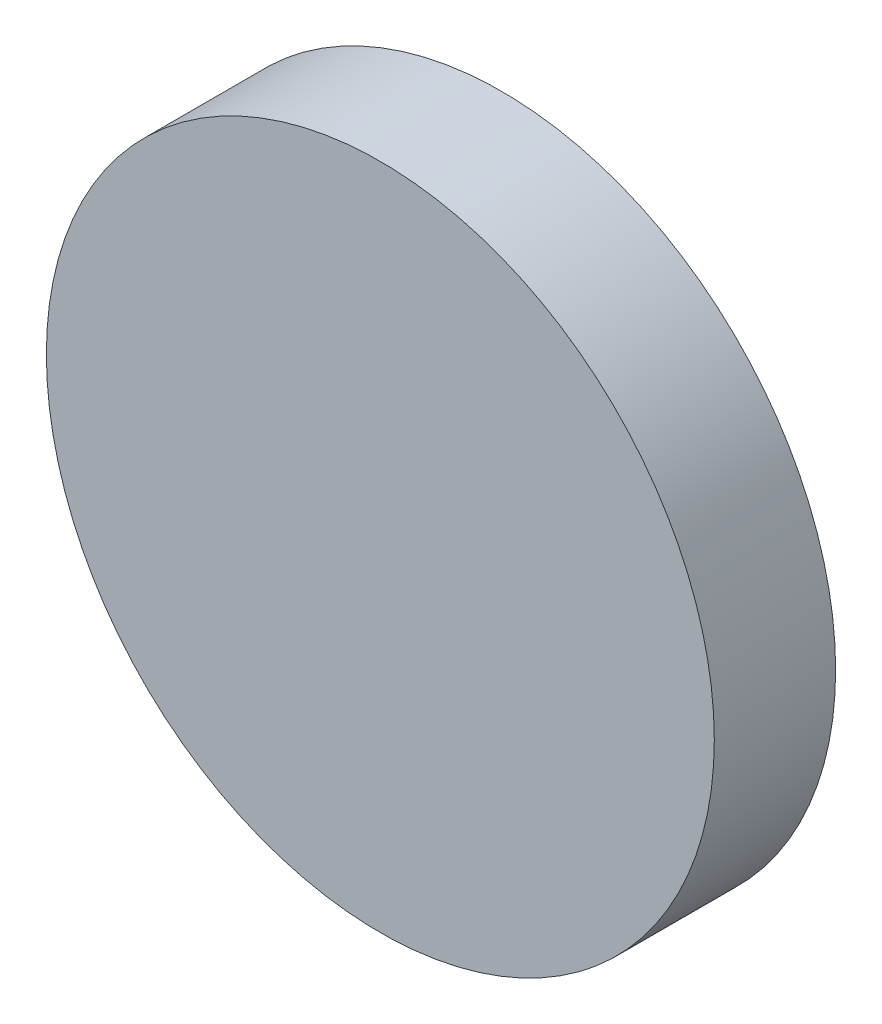
ISO-10303-21;
HEADER;
FILE_DESCRIPTION(('STEP AP214'),'2;1');
FILE_NAME('part.step','',(''),(''),'','','');
FILE_SCHEMA(('AUTOMOTIVE_DESIGN { 1 0 10303 214 1 1 1 1 }'));
ENDSEC;
DATA;
#1=APPLICATION_CONTEXT('core data for automotive mechanical design processes');
#2=APPLICATION_PROTOCOL_DEFINITION('international standard','automotive_design',2000,#1);
#3=PRODUCT_CONTEXT('',#1,'mechanical');
#4=PRODUCT('Part','Part','',(#3));
#5=PRODUCT_RELATED_PRODUCT_CATEGORY('part','',(#4));
#6=PRODUCT_DEFINITION_FORMATION('','',#4);
#7=PRODUCT_DEFINITION_CONTEXT('part definition',#1,'design');
#8=PRODUCT_DEFINITION('design','',#6,#7);
#9=PRODUCT_DEFINITION_SHAPE('','',#8);
#10=(LENGTH_UNIT() NAMED_UNIT(*) SI_UNIT(.MILLI.,.METRE.));
#11=(NAMED_UNIT(*) PLANE_ANGLE_UNIT() SI_UNIT($,.RADIAN.));
#12=(NAMED_UNIT(*) SI_UNIT($,.STERADIAN.) SOLID_ANGLE_UNIT());
#13=UNCERTAINTY_MEASURE_WITH_UNIT(LENGTH_MEASURE(1.E-05),#10,'distance_accuracy_value','');
#14=(GEOMETRIC_REPRESENTATION_CONTEXT(3) GLOBAL_UNCERTAINTY_ASSIGNED_CONTEXT((#13)) GLOBAL_UNIT_ASSIGNED_CONTEXT((#10,
#11,#12)) REPRESENTATION_CONTEXT('',''));
#15=CARTESIAN_POINT('',(0.,0.,0.));
#16=DIRECTION('',(0.,0.,1.));
#17=DIRECTION('',(1.,0.,0.));
#18=AXIS2_PLACEMENT_3D('',#15,#16,#17);
#19=CARTESIAN_POINT('',(0.,0.,10.));
#20=DIRECTION('',(0.,0.,-1.));
#21=DIRECTION('',(-1.,0.,0.));
#22=AXIS2_PLACEMENT_3D('',#19,#20,#21);
#23=CYLINDRICAL_SURFACE('',#22,27.5269863351518);
#24=CARTESIAN_POINT('',(0.,0.,10.));
#25=DIRECTION('',(0.,0.,1.));
#26=DIRECTION('',(1.,0.,0.));
#27=AXIS2_PLACEMENT_3D('',#24,#25,#26);
#28=CIRCLE('',#27,27.5269863351518);
#29=CARTESIAN_POINT('',(27.5269863351518,0.,10.));
#30=VERTEX_POINT('',#29);
#31=EDGE_CURVE('E10',#30,#30,#28,.T.);
#32=ORIENTED_EDGE('',*,*,#31,.F.);
#33=EDGE_LOOP('',(#32));
#34=FACE_BOUND('',#33,.T.);
#35=CARTESIAN_POINT('',(0.,0.,0.));
#36=DIRECTION('',(0.,0.,1.));
#37=DIRECTION('',(1.,0.,0.));
#38=AXIS2_PLACEMENT_3D('',#35,#36,#37);
#39=CIRCLE('',#38,27.5269863351518);
#40=CARTESIAN_POINT('',(27.5269863351518,0.,0.));
#41=VERTEX_POINT('',#40);
#42=EDGE_CURVE('E35',#41,#41,#39,.T.);
#43=ORIENTED_EDGE('',*,*,#42,.T.);
#44=EDGE_LOOP('',(#43));
#45=FACE_BOUND('',#44,.T.);
#46=ADVANCED_FACE('F32',(#34,#45),#23,.T.);
#47=CARTESIAN_POINT('',(0.,0.,10.));
#48=DIRECTION('',(0.,0.,1.));
#49=DIRECTION('',(1.,0.,0.));
#50=AXIS2_PLACEMENT_3D('',#47,#48,#49);
#51=PLANE('',#50);
#52=ORIENTED_EDGE('',*,*,#31,.T.);
#53=EDGE_LOOP('',(#52));
#54=FACE_BOUND('',#53,.T.);
#55=ADVANCED_FACE('F47',(#54),#51,.T.);
#56=CARTESIAN_POINT('',(0.,0.,0.));
#57=DIRECTION('',(0.,0.,1.));
#58=DIRECTION('',(1.,0.,0.));
#59=AXIS2_PLACEMENT_3D('',#56,#57,#58);
#60=PLANE('',#59);
#61=ORIENTED_EDGE('',*,*,#42,.F.);
#62=EDGE_LOOP('',(#61));
#63=FACE_BOUND('',#62,.T.);
#64=ADVANCED_FACE('F45',(#63),#60,.F.);
#65=CLOSED_SHELL('',(#46,#55,#64));
#66=MANIFOLD_SOLID_BREP('B2',#65);
#67=ADVANCED_BREP_SHAPE_REPRESENTATION('',(#18,#66),#14);
#68=SHAPE_DEFINITION_REPRESENTATION(#9,#67);
ENDSEC;
END-ISO-10303-21;
